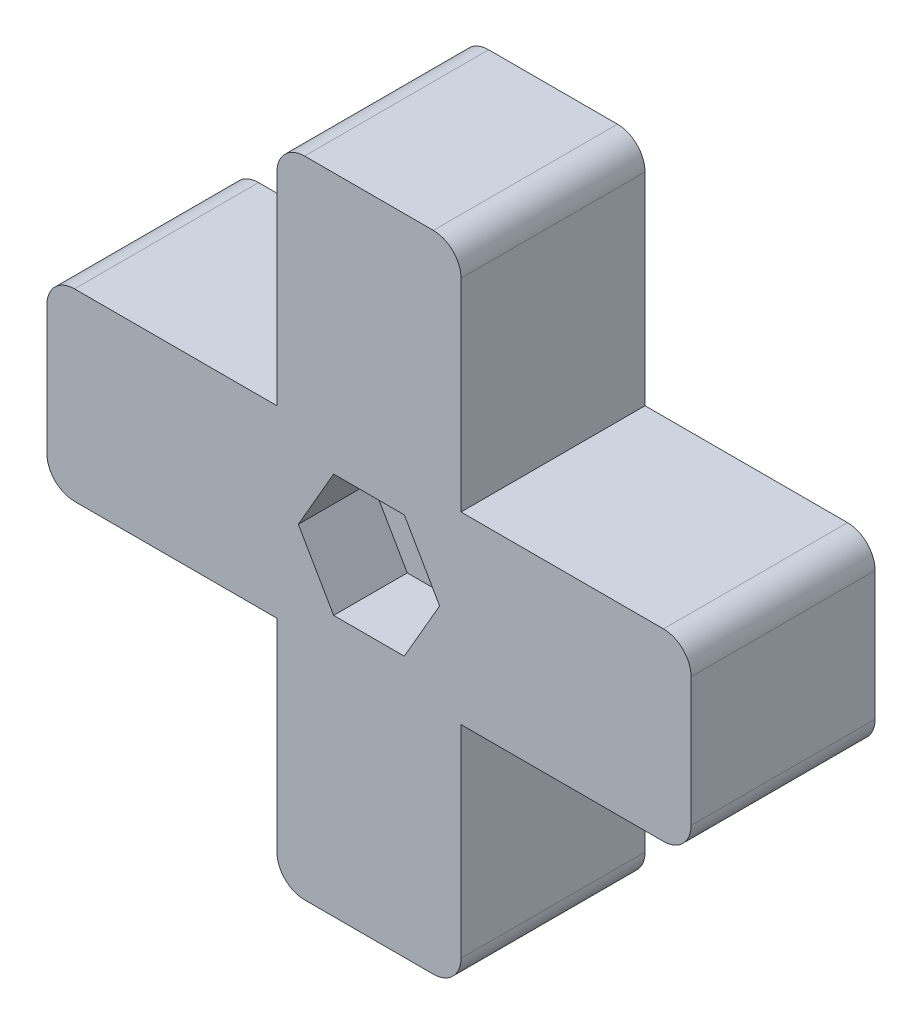
ISO-10303-21;
HEADER;
FILE_DESCRIPTION(('STEP AP214'),'2;1');
FILE_NAME('part.step','',(''),(''),'','','');
FILE_SCHEMA(('AUTOMOTIVE_DESIGN { 1 0 10303 214 1 1 1 1 }'));
ENDSEC;
DATA;
#1=APPLICATION_CONTEXT('core data for automotive mechanical design processes');
#2=APPLICATION_PROTOCOL_DEFINITION('international standard','automotive_design',2000,#1);
#3=PRODUCT_CONTEXT('',#1,'mechanical');
#4=PRODUCT('Part','Part','',(#3));
#5=PRODUCT_RELATED_PRODUCT_CATEGORY('part','',(#4));
#6=PRODUCT_DEFINITION_FORMATION('','',#4);
#7=PRODUCT_DEFINITION_CONTEXT('part definition',#1,'design');
#8=PRODUCT_DEFINITION('design','',#6,#7);
#9=PRODUCT_DEFINITION_SHAPE('','',#8);
#10=(LENGTH_UNIT() NAMED_UNIT(*) SI_UNIT(.MILLI.,.METRE.));
#11=(NAMED_UNIT(*) PLANE_ANGLE_UNIT() SI_UNIT($,.RADIAN.));
#12=(NAMED_UNIT(*) SI_UNIT($,.STERADIAN.) SOLID_ANGLE_UNIT());
#13=UNCERTAINTY_MEASURE_WITH_UNIT(LENGTH_MEASURE(1.E-05),#10,'distance_accuracy_value','');
#14=(GEOMETRIC_REPRESENTATION_CONTEXT(3) GLOBAL_UNCERTAINTY_ASSIGNED_CONTEXT((#13)) GLOBAL_UNIT_ASSIGNED_CONTEXT((#10,
#11,#12)) REPRESENTATION_CONTEXT('',''));
#15=CARTESIAN_POINT('',(0.,0.,0.));
#16=DIRECTION('',(0.,0.,1.));
#17=DIRECTION('',(1.,0.,0.));
#18=AXIS2_PLACEMENT_3D('',#15,#16,#17);
#19=CARTESIAN_POINT('',(35.,10.,-0.001000000000001));
#20=DIRECTION('',(0.,0.,1.));
#21=DIRECTION('',(1.,0.,0.));
#22=AXIS2_PLACEMENT_3D('',#19,#20,#21);
#23=CYLINDRICAL_SURFACE('',#22,4.05);
#24=CARTESIAN_POINT('',(35.,10.,0.));
#25=DIRECTION('',(0.,0.,1.));
#26=DIRECTION('',(1.,0.,0.));
#27=AXIS2_PLACEMENT_3D('',#24,#25,#26);
#28=CIRCLE('',#27,4.05);
#29=CARTESIAN_POINT('',(39.05,10.,0.));
#30=VERTEX_POINT('',#29);
#31=EDGE_CURVE('E270',#30,#30,#28,.F.);
#32=ORIENTED_EDGE('',*,*,#31,.T.);
#33=EDGE_LOOP('',(#32));
#34=FACE_BOUND('',#33,.T.);
#35=CARTESIAN_POINT('',(35.,10.,12.));
#36=DIRECTION('',(0.,0.,1.));
#37=DIRECTION('',(1.,0.,0.));
#38=AXIS2_PLACEMENT_3D('',#35,#36,#37);
#39=CIRCLE('',#38,4.05);
#40=CARTESIAN_POINT('',(39.05,10.,12.));
#41=VERTEX_POINT('',#40);
#42=EDGE_CURVE('E262',#41,#41,#39,.F.);
#43=ORIENTED_EDGE('',*,*,#42,.F.);
#44=EDGE_LOOP('',(#43));
#45=FACE_BOUND('',#44,.T.);
#46=ADVANCED_FACE('F35',(#34,#45),#23,.F.);
#47=CARTESIAN_POINT('',(0.,45.,20.));
#48=DIRECTION('',(0.,-1.,0.));
#49=DIRECTION('',(0.,0.,-1.));
#50=AXIS2_PLACEMENT_3D('',#47,#48,#49);
#51=PLANE('',#50);
#52=DIRECTION('',(-1.,0.,0.));
#53=VECTOR('',#52,1.);
#54=CARTESIAN_POINT('',(0.,45.,20.));
#55=LINE('',#54,#53);
#56=CARTESIAN_POINT('',(42.,45.,20.));
#57=VERTEX_POINT('',#56);
#58=CARTESIAN_POINT('',(28.,45.,20.));
#59=VERTEX_POINT('',#58);
#60=EDGE_CURVE('E274',#57,#59,#55,.T.);
#61=ORIENTED_EDGE('',*,*,#60,.F.);
#62=DIRECTION('',(0.,0.,-1.));
#63=VECTOR('',#62,1.);
#64=CARTESIAN_POINT('',(42.,45.,0.));
#65=LINE('',#64,#63);
#66=CARTESIAN_POINT('',(42.,45.,0.));
#67=VERTEX_POINT('',#66);
#68=EDGE_CURVE('E351',#57,#67,#65,.T.);
#69=ORIENTED_EDGE('',*,*,#68,.T.);
#70=DIRECTION('',(-1.,0.,0.));
#71=VECTOR('',#70,1.);
#72=CARTESIAN_POINT('',(0.,45.,0.));
#73=LINE('',#72,#71);
#74=CARTESIAN_POINT('',(28.,45.,0.));
#75=VERTEX_POINT('',#74);
#76=EDGE_CURVE('E273',#67,#75,#73,.T.);
#77=ORIENTED_EDGE('',*,*,#76,.T.);
#78=DIRECTION('',(0.,0.,-1.));
#79=VECTOR('',#78,1.);
#80=CARTESIAN_POINT('',(28.,45.,20.));
#81=LINE('',#80,#79);
#82=EDGE_CURVE('E347',#75,#59,#81,.F.);
#83=ORIENTED_EDGE('',*,*,#82,.T.);
#84=EDGE_LOOP('',(#61,#69,#77,#83));
#85=FACE_BOUND('',#84,.T.);
#86=ADVANCED_FACE('F484',(#85),#51,.F.);
#87=CARTESIAN_POINT('',(25.,0.,20.));
#88=DIRECTION('',(1.,0.,0.));
#89=DIRECTION('',(0.,0.,-1.));
#90=AXIS2_PLACEMENT_3D('',#87,#88,#89);
#91=PLANE('',#90);
#92=DIRECTION('',(0.,-1.,0.));
#93=VECTOR('',#92,1.);
#94=CARTESIAN_POINT('',(25.,0.,20.));
#95=LINE('',#94,#93);
#96=CARTESIAN_POINT('',(25.,42.,20.));
#97=VERTEX_POINT('',#96);
#98=CARTESIAN_POINT('',(25.,20.,20.));
#99=VERTEX_POINT('',#98);
#100=EDGE_CURVE('E277',#97,#99,#95,.T.);
#101=ORIENTED_EDGE('',*,*,#100,.F.);
#102=DIRECTION('',(0.,0.,-1.));
#103=VECTOR('',#102,1.);
#104=CARTESIAN_POINT('',(25.,42.,20.));
#105=LINE('',#104,#103);
#106=CARTESIAN_POINT('',(25.,42.,0.));
#107=VERTEX_POINT('',#106);
#108=EDGE_CURVE('E397',#97,#107,#105,.T.);
#109=ORIENTED_EDGE('',*,*,#108,.T.);
#110=DIRECTION('',(0.,-1.,0.));
#111=VECTOR('',#110,1.);
#112=CARTESIAN_POINT('',(25.,0.,0.));
#113=LINE('',#112,#111);
#114=CARTESIAN_POINT('',(25.,20.,0.));
#115=VERTEX_POINT('',#114);
#116=EDGE_CURVE('E309',#107,#115,#113,.T.);
#117=ORIENTED_EDGE('',*,*,#116,.T.);
#118=DIRECTION('',(0.,0.,-1.));
#119=VECTOR('',#118,1.);
#120=CARTESIAN_POINT('',(25.,20.,20.));
#121=LINE('',#120,#119);
#122=EDGE_CURVE('E344',#99,#115,#121,.T.);
#123=ORIENTED_EDGE('',*,*,#122,.F.);
#124=EDGE_LOOP('',(#101,#109,#117,#123));
#125=FACE_BOUND('',#124,.T.);
#126=ADVANCED_FACE('F494',(#125),#91,.F.);
#127=CARTESIAN_POINT('',(0.,20.,20.));
#128=DIRECTION('',(0.,1.,0.));
#129=DIRECTION('',(0.,0.,1.));
#130=AXIS2_PLACEMENT_3D('',#127,#128,#129);
#131=PLANE('',#130);
#132=DIRECTION('',(1.,0.,0.));
#133=VECTOR('',#132,1.);
#134=CARTESIAN_POINT('',(0.,20.,0.));
#135=LINE('',#134,#133);
#136=CARTESIAN_POINT('',(3.,20.,0.));
#137=VERTEX_POINT('',#136);
#138=EDGE_CURVE('E311',#137,#115,#135,.T.);
#139=ORIENTED_EDGE('',*,*,#138,.F.);
#140=DIRECTION('',(0.,0.,-1.));
#141=VECTOR('',#140,1.);
#142=CARTESIAN_POINT('',(3.,20.,20.));
#143=LINE('',#142,#141);
#144=CARTESIAN_POINT('',(3.,20.,20.));
#145=VERTEX_POINT('',#144);
#146=EDGE_CURVE('E11',#137,#145,#143,.F.);
#147=ORIENTED_EDGE('',*,*,#146,.T.);
#148=DIRECTION('',(1.,0.,0.));
#149=VECTOR('',#148,1.);
#150=CARTESIAN_POINT('',(0.,20.,20.));
#151=LINE('',#150,#149);
#152=EDGE_CURVE('E281',#145,#99,#151,.T.);
#153=ORIENTED_EDGE('',*,*,#152,.T.);
#154=ORIENTED_EDGE('',*,*,#122,.T.);
#155=EDGE_LOOP('',(#139,#147,#153,#154));
#156=FACE_BOUND('',#155,.T.);
#157=ADVANCED_FACE('F500',(#156),#131,.T.);
#158=CARTESIAN_POINT('',(0.,0.,20.));
#159=DIRECTION('',(-1.,0.,0.));
#160=DIRECTION('',(0.,0.,1.));
#161=AXIS2_PLACEMENT_3D('',#158,#159,#160);
#162=PLANE('',#161);
#163=DIRECTION('',(0.,1.,0.));
#164=VECTOR('',#163,1.);
#165=CARTESIAN_POINT('',(0.,0.,0.));
#166=LINE('',#165,#164);
#167=CARTESIAN_POINT('',(0.,3.,0.));
#168=VERTEX_POINT('',#167);
#169=CARTESIAN_POINT('',(0.,17.,0.));
#170=VERTEX_POINT('',#169);
#171=EDGE_CURVE('E314',#168,#170,#166,.T.);
#172=ORIENTED_EDGE('',*,*,#171,.F.);
#173=DIRECTION('',(0.,0.,-1.));
#174=VECTOR('',#173,1.);
#175=CARTESIAN_POINT('',(0.,3.,20.));
#176=LINE('',#175,#174);
#177=CARTESIAN_POINT('',(0.,3.,20.));
#178=VERTEX_POINT('',#177);
#179=EDGE_CURVE('E43',#168,#178,#176,.F.);
#180=ORIENTED_EDGE('',*,*,#179,.T.);
#181=DIRECTION('',(0.,1.,0.));
#182=VECTOR('',#181,1.);
#183=CARTESIAN_POINT('',(0.,0.,20.));
#184=LINE('',#183,#182);
#185=CARTESIAN_POINT('',(0.,17.,20.));
#186=VERTEX_POINT('',#185);
#187=EDGE_CURVE('E283',#178,#186,#184,.T.);
#188=ORIENTED_EDGE('',*,*,#187,.T.);
#189=DIRECTION('',(0.,0.,-1.));
#190=VECTOR('',#189,1.);
#191=CARTESIAN_POINT('',(0.,17.,20.));
#192=LINE('',#191,#190);
#193=EDGE_CURVE('E412',#186,#170,#192,.T.);
#194=ORIENTED_EDGE('',*,*,#193,.T.);
#195=EDGE_LOOP('',(#172,#180,#188,#194));
#196=FACE_BOUND('',#195,.T.);
#197=ADVANCED_FACE('F418',(#196),#162,.T.);
#198=CARTESIAN_POINT('',(0.,0.,20.));
#199=DIRECTION('',(0.,1.,0.));
#200=DIRECTION('',(0.,0.,1.));
#201=AXIS2_PLACEMENT_3D('',#198,#199,#200);
#202=PLANE('',#201);
#203=DIRECTION('',(1.,0.,0.));
#204=VECTOR('',#203,1.);
#205=CARTESIAN_POINT('',(0.,0.,20.));
#206=LINE('',#205,#204);
#207=CARTESIAN_POINT('',(3.,0.,20.));
#208=VERTEX_POINT('',#207);
#209=CARTESIAN_POINT('',(25.,0.,20.));
#210=VERTEX_POINT('',#209);
#211=EDGE_CURVE('E286',#208,#210,#206,.T.);
#212=ORIENTED_EDGE('',*,*,#211,.F.);
#213=DIRECTION('',(0.,0.,-1.));
#214=VECTOR('',#213,1.);
#215=CARTESIAN_POINT('',(3.,0.,0.));
#216=LINE('',#215,#214);
#217=CARTESIAN_POINT('',(3.,0.,0.));
#218=VERTEX_POINT('',#217);
#219=EDGE_CURVE('E409',#208,#218,#216,.T.);
#220=ORIENTED_EDGE('',*,*,#219,.T.);
#221=DIRECTION('',(1.,0.,0.));
#222=VECTOR('',#221,1.);
#223=CARTESIAN_POINT('',(0.,0.,0.));
#224=LINE('',#223,#222);
#225=CARTESIAN_POINT('',(25.,0.,0.));
#226=VERTEX_POINT('',#225);
#227=EDGE_CURVE('E317',#218,#226,#224,.T.);
#228=ORIENTED_EDGE('',*,*,#227,.T.);
#229=DIRECTION('',(0.,0.,-1.));
#230=VECTOR('',#229,1.);
#231=CARTESIAN_POINT('',(25.,0.,20.));
#232=LINE('',#231,#230);
#233=EDGE_CURVE('E341',#210,#226,#232,.T.);
#234=ORIENTED_EDGE('',*,*,#233,.F.);
#235=EDGE_LOOP('',(#212,#220,#228,#234));
#236=FACE_BOUND('',#235,.T.);
#237=ADVANCED_FACE('F431',(#236),#202,.F.);
#238=CARTESIAN_POINT('',(25.,0.,20.));
#239=DIRECTION('',(1.,0.,0.));
#240=DIRECTION('',(0.,0.,-1.));
#241=AXIS2_PLACEMENT_3D('',#238,#239,#240);
#242=PLANE('',#241);
#243=DIRECTION('',(0.,-1.,0.));
#244=VECTOR('',#243,1.);
#245=CARTESIAN_POINT('',(25.,0.,0.));
#246=LINE('',#245,#244);
#247=CARTESIAN_POINT('',(25.,-22.,0.));
#248=VERTEX_POINT('',#247);
#249=EDGE_CURVE('E319',#226,#248,#246,.T.);
#250=ORIENTED_EDGE('',*,*,#249,.T.);
#251=DIRECTION('',(0.,0.,-1.));
#252=VECTOR('',#251,1.);
#253=CARTESIAN_POINT('',(25.,-22.,20.));
#254=LINE('',#253,#252);
#255=CARTESIAN_POINT('',(25.,-22.,20.));
#256=VERTEX_POINT('',#255);
#257=EDGE_CURVE('E395',#248,#256,#254,.F.);
#258=ORIENTED_EDGE('',*,*,#257,.T.);
#259=DIRECTION('',(0.,-1.,0.));
#260=VECTOR('',#259,1.);
#261=CARTESIAN_POINT('',(25.,0.,20.));
#262=LINE('',#261,#260);
#263=EDGE_CURVE('E288',#210,#256,#262,.T.);
#264=ORIENTED_EDGE('',*,*,#263,.F.);
#265=ORIENTED_EDGE('',*,*,#233,.T.);
#266=EDGE_LOOP('',(#250,#258,#264,#265));
#267=FACE_BOUND('',#266,.T.);
#268=ADVANCED_FACE('F439',(#267),#242,.F.);
#269=CARTESIAN_POINT('',(0.,-25.,20.));
#270=DIRECTION('',(0.,-1.,0.));
#271=DIRECTION('',(1.,0.,0.));
#272=AXIS2_PLACEMENT_3D('',#269,#270,#271);
#273=PLANE('',#272);
#274=DIRECTION('',(-1.,0.,0.));
#275=VECTOR('',#274,1.);
#276=CARTESIAN_POINT('',(0.,-25.,0.));
#277=LINE('',#276,#275);
#278=CARTESIAN_POINT('',(42.,-25.,0.));
#279=VERTEX_POINT('',#278);
#280=CARTESIAN_POINT('',(28.,-25.,0.));
#281=VERTEX_POINT('',#280);
#282=EDGE_CURVE('E322',#279,#281,#277,.T.);
#283=ORIENTED_EDGE('',*,*,#282,.F.);
#284=DIRECTION('',(0.,0.,-1.));
#285=VECTOR('',#284,1.);
#286=CARTESIAN_POINT('',(42.,-25.,20.));
#287=LINE('',#286,#285);
#288=CARTESIAN_POINT('',(42.,-25.,20.));
#289=VERTEX_POINT('',#288);
#290=EDGE_CURVE('E393',#279,#289,#287,.F.);
#291=ORIENTED_EDGE('',*,*,#290,.T.);
#292=DIRECTION('',(-1.,0.,0.));
#293=VECTOR('',#292,1.);
#294=CARTESIAN_POINT('',(0.,-25.,20.));
#295=LINE('',#294,#293);
#296=CARTESIAN_POINT('',(28.,-25.,20.));
#297=VERTEX_POINT('',#296);
#298=EDGE_CURVE('E291',#289,#297,#295,.T.);
#299=ORIENTED_EDGE('',*,*,#298,.T.);
#300=DIRECTION('',(0.,0.,-1.));
#301=VECTOR('',#300,1.);
#302=CARTESIAN_POINT('',(28.,-25.,0.));
#303=LINE('',#302,#301);
#304=EDGE_CURVE('E390',#297,#281,#303,.T.);
#305=ORIENTED_EDGE('',*,*,#304,.T.);
#306=EDGE_LOOP('',(#283,#291,#299,#305));
#307=FACE_BOUND('',#306,.T.);
#308=ADVANCED_FACE('F449',(#307),#273,.T.);
#309=CARTESIAN_POINT('',(45.,0.,20.));
#310=DIRECTION('',(1.,0.,0.));
#311=DIRECTION('',(0.,1.,0.));
#312=AXIS2_PLACEMENT_3D('',#309,#310,#311);
#313=PLANE('',#312);
#314=DIRECTION('',(0.,-1.,0.));
#315=VECTOR('',#314,1.);
#316=CARTESIAN_POINT('',(45.,0.,20.));
#317=LINE('',#316,#315);
#318=CARTESIAN_POINT('',(45.,0.,20.));
#319=VERTEX_POINT('',#318);
#320=CARTESIAN_POINT('',(45.,-22.,20.));
#321=VERTEX_POINT('',#320);
#322=EDGE_CURVE('E294',#319,#321,#317,.T.);
#323=ORIENTED_EDGE('',*,*,#322,.T.);
#324=DIRECTION('',(0.,0.,-1.));
#325=VECTOR('',#324,1.);
#326=CARTESIAN_POINT('',(45.,-22.,20.));
#327=LINE('',#326,#325);
#328=CARTESIAN_POINT('',(45.,-22.,0.));
#329=VERTEX_POINT('',#328);
#330=EDGE_CURVE('E387',#321,#329,#327,.T.);
#331=ORIENTED_EDGE('',*,*,#330,.T.);
#332=DIRECTION('',(0.,-1.,0.));
#333=VECTOR('',#332,1.);
#334=CARTESIAN_POINT('',(45.,0.,0.));
#335=LINE('',#334,#333);
#336=CARTESIAN_POINT('',(45.,0.,0.));
#337=VERTEX_POINT('',#336);
#338=EDGE_CURVE('E325',#337,#329,#335,.T.);
#339=ORIENTED_EDGE('',*,*,#338,.F.);
#340=DIRECTION('',(0.,0.,-1.));
#341=VECTOR('',#340,1.);
#342=CARTESIAN_POINT('',(45.,0.,20.));
#343=LINE('',#342,#341);
#344=EDGE_CURVE('E339',#319,#337,#343,.T.);
#345=ORIENTED_EDGE('',*,*,#344,.F.);
#346=EDGE_LOOP('',(#323,#331,#339,#345));
#347=FACE_BOUND('',#346,.T.);
#348=ADVANCED_FACE('F456',(#347),#313,.T.);
#349=CARTESIAN_POINT('',(0.,0.,20.));
#350=DIRECTION('',(0.,1.,0.));
#351=DIRECTION('',(0.,0.,1.));
#352=AXIS2_PLACEMENT_3D('',#349,#350,#351);
#353=PLANE('',#352);
#354=DIRECTION('',(1.,0.,0.));
#355=VECTOR('',#354,1.);
#356=CARTESIAN_POINT('',(0.,0.,0.));
#357=LINE('',#356,#355);
#358=CARTESIAN_POINT('',(67.,0.,0.));
#359=VERTEX_POINT('',#358);
#360=EDGE_CURVE('E328',#337,#359,#357,.T.);
#361=ORIENTED_EDGE('',*,*,#360,.T.);
#362=DIRECTION('',(0.,0.,-1.));
#363=VECTOR('',#362,1.);
#364=CARTESIAN_POINT('',(67.,0.,20.));
#365=LINE('',#364,#363);
#366=CARTESIAN_POINT('',(67.,0.,20.));
#367=VERTEX_POINT('',#366);
#368=EDGE_CURVE('E407',#359,#367,#365,.F.);
#369=ORIENTED_EDGE('',*,*,#368,.T.);
#370=DIRECTION('',(1.,0.,0.));
#371=VECTOR('',#370,1.);
#372=CARTESIAN_POINT('',(0.,0.,20.));
#373=LINE('',#372,#371);
#374=EDGE_CURVE('E297',#319,#367,#373,.T.);
#375=ORIENTED_EDGE('',*,*,#374,.F.);
#376=ORIENTED_EDGE('',*,*,#344,.T.);
#377=EDGE_LOOP('',(#361,#369,#375,#376));
#378=FACE_BOUND('',#377,.T.);
#379=ADVANCED_FACE('F461',(#378),#353,.F.);
#380=CARTESIAN_POINT('',(70.,0.,20.));
#381=DIRECTION('',(-1.,0.,0.));
#382=DIRECTION('',(0.,0.,1.));
#383=AXIS2_PLACEMENT_3D('',#380,#381,#382);
#384=PLANE('',#383);
#385=DIRECTION('',(0.,1.,0.));
#386=VECTOR('',#385,1.);
#387=CARTESIAN_POINT('',(70.,0.,0.));
#388=LINE('',#387,#386);
#389=CARTESIAN_POINT('',(70.,3.,0.));
#390=VERTEX_POINT('',#389);
#391=CARTESIAN_POINT('',(70.,17.,0.));
#392=VERTEX_POINT('',#391);
#393=EDGE_CURVE('E331',#390,#392,#388,.T.);
#394=ORIENTED_EDGE('',*,*,#393,.T.);
#395=DIRECTION('',(0.,0.,-1.));
#396=VECTOR('',#395,1.);
#397=CARTESIAN_POINT('',(70.,17.,20.));
#398=LINE('',#397,#396);
#399=CARTESIAN_POINT('',(70.,17.,20.));
#400=VERTEX_POINT('',#399);
#401=EDGE_CURVE('E58',#392,#400,#398,.F.);
#402=ORIENTED_EDGE('',*,*,#401,.T.);
#403=DIRECTION('',(0.,1.,0.));
#404=VECTOR('',#403,1.);
#405=CARTESIAN_POINT('',(70.,0.,20.));
#406=LINE('',#405,#404);
#407=CARTESIAN_POINT('',(70.,3.,20.));
#408=VERTEX_POINT('',#407);
#409=EDGE_CURVE('E300',#408,#400,#406,.T.);
#410=ORIENTED_EDGE('',*,*,#409,.F.);
#411=DIRECTION('',(0.,0.,-1.));
#412=VECTOR('',#411,1.);
#413=CARTESIAN_POINT('',(70.,3.,20.));
#414=LINE('',#413,#412);
#415=EDGE_CURVE('E403',#408,#390,#414,.T.);
#416=ORIENTED_EDGE('',*,*,#415,.T.);
#417=EDGE_LOOP('',(#394,#402,#410,#416));
#418=FACE_BOUND('',#417,.T.);
#419=ADVANCED_FACE('F468',(#418),#384,.F.);
#420=CARTESIAN_POINT('',(0.,20.,20.));
#421=DIRECTION('',(0.,1.,0.));
#422=DIRECTION('',(0.,0.,1.));
#423=AXIS2_PLACEMENT_3D('',#420,#421,#422);
#424=PLANE('',#423);
#425=DIRECTION('',(1.,0.,0.));
#426=VECTOR('',#425,1.);
#427=CARTESIAN_POINT('',(0.,20.,20.));
#428=LINE('',#427,#426);
#429=CARTESIAN_POINT('',(45.,20.,20.));
#430=VERTEX_POINT('',#429);
#431=CARTESIAN_POINT('',(67.,20.,20.));
#432=VERTEX_POINT('',#431);
#433=EDGE_CURVE('E302',#430,#432,#428,.T.);
#434=ORIENTED_EDGE('',*,*,#433,.T.);
#435=DIRECTION('',(0.,0.,-1.));
#436=VECTOR('',#435,1.);
#437=CARTESIAN_POINT('',(67.,20.,0.));
#438=LINE('',#437,#436);
#439=CARTESIAN_POINT('',(67.,20.,0.));
#440=VERTEX_POINT('',#439);
#441=EDGE_CURVE('E400',#432,#440,#438,.T.);
#442=ORIENTED_EDGE('',*,*,#441,.T.);
#443=DIRECTION('',(1.,0.,0.));
#444=VECTOR('',#443,1.);
#445=CARTESIAN_POINT('',(0.,20.,0.));
#446=LINE('',#445,#444);
#447=CARTESIAN_POINT('',(45.,20.,0.));
#448=VERTEX_POINT('',#447);
#449=EDGE_CURVE('E333',#448,#440,#446,.T.);
#450=ORIENTED_EDGE('',*,*,#449,.F.);
#451=DIRECTION('',(0.,0.,-1.));
#452=VECTOR('',#451,1.);
#453=CARTESIAN_POINT('',(45.,20.,20.));
#454=LINE('',#453,#452);
#455=EDGE_CURVE('E306',#430,#448,#454,.T.);
#456=ORIENTED_EDGE('',*,*,#455,.F.);
#457=EDGE_LOOP('',(#434,#442,#450,#456));
#458=FACE_BOUND('',#457,.T.);
#459=ADVANCED_FACE('F474',(#458),#424,.T.);
#460=CARTESIAN_POINT('',(45.,0.,20.));
#461=DIRECTION('',(1.,0.,0.));
#462=DIRECTION('',(0.,1.,0.));
#463=AXIS2_PLACEMENT_3D('',#460,#461,#462);
#464=PLANE('',#463);
#465=DIRECTION('',(0.,-1.,0.));
#466=VECTOR('',#465,1.);
#467=CARTESIAN_POINT('',(45.,0.,0.));
#468=LINE('',#467,#466);
#469=CARTESIAN_POINT('',(45.,42.,0.));
#470=VERTEX_POINT('',#469);
#471=EDGE_CURVE('E278',#470,#448,#468,.T.);
#472=ORIENTED_EDGE('',*,*,#471,.F.);
#473=DIRECTION('',(0.,0.,-1.));
#474=VECTOR('',#473,1.);
#475=CARTESIAN_POINT('',(45.,42.,20.));
#476=LINE('',#475,#474);
#477=CARTESIAN_POINT('',(45.,42.,20.));
#478=VERTEX_POINT('',#477);
#479=EDGE_CURVE('E370',#470,#478,#476,.F.);
#480=ORIENTED_EDGE('',*,*,#479,.T.);
#481=DIRECTION('',(0.,-1.,0.));
#482=VECTOR('',#481,1.);
#483=CARTESIAN_POINT('',(45.,0.,20.));
#484=LINE('',#483,#482);
#485=EDGE_CURVE('E304',#478,#430,#484,.T.);
#486=ORIENTED_EDGE('',*,*,#485,.T.);
#487=ORIENTED_EDGE('',*,*,#455,.T.);
#488=EDGE_LOOP('',(#472,#480,#486,#487));
#489=FACE_BOUND('',#488,.T.);
#490=ADVANCED_FACE('F522',(#489),#464,.T.);
#491=CARTESIAN_POINT('',(0.,0.,20.));
#492=DIRECTION('',(0.,0.,1.));
#493=DIRECTION('',(1.,0.,0.));
#494=AXIS2_PLACEMENT_3D('',#491,#492,#493);
#495=PLANE('',#494);
#496=DIRECTION('',(-0.5,-0.866025403784439,0.));
#497=VECTOR('',#496,1.);
#498=CARTESIAN_POINT('',(31.160620709889,16.65,20.));
#499=LINE('',#498,#497);
#500=CARTESIAN_POINT('',(31.160620709889,16.65,20.));
#501=VERTEX_POINT('',#500);
#502=CARTESIAN_POINT('',(27.321241419778,9.99999999999999,20.));
#503=VERTEX_POINT('',#502);
#504=EDGE_CURVE('E217',#501,#503,#499,.T.);
#505=ORIENTED_EDGE('',*,*,#504,.F.);
#506=DIRECTION('',(-1.,0.,0.));
#507=VECTOR('',#506,1.);
#508=CARTESIAN_POINT('',(38.839379290111,16.65,20.));
#509=LINE('',#508,#507);
#510=CARTESIAN_POINT('',(38.839379290111,16.65,20.));
#511=VERTEX_POINT('',#510);
#512=EDGE_CURVE('E236',#511,#501,#509,.T.);
#513=ORIENTED_EDGE('',*,*,#512,.F.);
#514=DIRECTION('',(-0.500000000000001,0.866025403784438,0.));
#515=VECTOR('',#514,1.);
#516=CARTESIAN_POINT('',(42.678758580222,10.,20.));
#517=LINE('',#516,#515);
#518=CARTESIAN_POINT('',(42.678758580222,10.,20.));
#519=VERTEX_POINT('',#518);
#520=EDGE_CURVE('E239',#519,#511,#517,.T.);
#521=ORIENTED_EDGE('',*,*,#520,.F.);
#522=DIRECTION('',(0.499999999999999,0.866025403784439,0.));
#523=VECTOR('',#522,1.);
#524=CARTESIAN_POINT('',(38.839379290111,3.35,20.));
#525=LINE('',#524,#523);
#526=CARTESIAN_POINT('',(38.839379290111,3.35,20.));
#527=VERTEX_POINT('',#526);
#528=EDGE_CURVE('E255',#527,#519,#525,.T.);
#529=ORIENTED_EDGE('',*,*,#528,.F.);
#530=DIRECTION('',(1.,0.,0.));
#531=VECTOR('',#530,1.);
#532=CARTESIAN_POINT('',(31.160620709889,3.35,20.));
#533=LINE('',#532,#531);
#534=CARTESIAN_POINT('',(31.160620709889,3.35,20.));
#535=VERTEX_POINT('',#534);
#536=EDGE_CURVE('E252',#535,#527,#533,.T.);
#537=ORIENTED_EDGE('',*,*,#536,.F.);
#538=DIRECTION('',(0.5,-0.866025403784438,0.));
#539=VECTOR('',#538,1.);
#540=CARTESIAN_POINT('',(27.321241419778,9.99999999999999,20.));
#541=LINE('',#540,#539);
#542=EDGE_CURVE('E250',#503,#535,#541,.T.);
#543=ORIENTED_EDGE('',*,*,#542,.F.);
#544=EDGE_LOOP('',(#505,#513,#521,#529,#537,#543));
#545=FACE_BOUND('',#544,.T.);
#546=ORIENTED_EDGE('',*,*,#485,.F.);
#547=CARTESIAN_POINT('',(42.,42.,20.));
#548=DIRECTION('',(0.,0.,1.));
#549=DIRECTION('',(1.,0.,0.));
#550=AXIS2_PLACEMENT_3D('',#547,#548,#549);
#551=CIRCLE('',#550,3.);
#552=EDGE_CURVE('E385',#478,#57,#551,.T.);
#553=ORIENTED_EDGE('',*,*,#552,.T.);
#554=ORIENTED_EDGE('',*,*,#60,.T.);
#555=CARTESIAN_POINT('',(28.,42.,20.));
#556=DIRECTION('',(0.,0.,1.));
#557=DIRECTION('',(1.,0.,0.));
#558=AXIS2_PLACEMENT_3D('',#555,#556,#557);
#559=CIRCLE('',#558,3.);
#560=EDGE_CURVE('E379',#59,#97,#559,.T.);
#561=ORIENTED_EDGE('',*,*,#560,.T.);
#562=ORIENTED_EDGE('',*,*,#100,.T.);
#563=ORIENTED_EDGE('',*,*,#152,.F.);
#564=CARTESIAN_POINT('',(3.,17.,20.));
#565=DIRECTION('',(0.,0.,1.));
#566=DIRECTION('',(1.,0.,0.));
#567=AXIS2_PLACEMENT_3D('',#564,#565,#566);
#568=CIRCLE('',#567,3.);
#569=EDGE_CURVE('E372',#145,#186,#568,.T.);
#570=ORIENTED_EDGE('',*,*,#569,.T.);
#571=ORIENTED_EDGE('',*,*,#187,.F.);
#572=CARTESIAN_POINT('',(3.,3.,20.));
#573=DIRECTION('',(0.,0.,1.));
#574=DIRECTION('',(1.,0.,0.));
#575=AXIS2_PLACEMENT_3D('',#572,#573,#574);
#576=CIRCLE('',#575,3.);
#577=EDGE_CURVE('E374',#178,#208,#576,.T.);
#578=ORIENTED_EDGE('',*,*,#577,.T.);
#579=ORIENTED_EDGE('',*,*,#211,.T.);
#580=ORIENTED_EDGE('',*,*,#263,.T.);
#581=CARTESIAN_POINT('',(28.,-22.,20.));
#582=DIRECTION('',(0.,0.,1.));
#583=DIRECTION('',(1.,0.,0.));
#584=AXIS2_PLACEMENT_3D('',#581,#582,#583);
#585=CIRCLE('',#584,3.);
#586=EDGE_CURVE('E381',#256,#297,#585,.T.);
#587=ORIENTED_EDGE('',*,*,#586,.T.);
#588=ORIENTED_EDGE('',*,*,#298,.F.);
#589=CARTESIAN_POINT('',(42.,-22.,20.));
#590=DIRECTION('',(0.,0.,1.));
#591=DIRECTION('',(1.,0.,0.));
#592=AXIS2_PLACEMENT_3D('',#589,#590,#591);
#593=CIRCLE('',#592,3.);
#594=EDGE_CURVE('E383',#289,#321,#593,.T.);
#595=ORIENTED_EDGE('',*,*,#594,.T.);
#596=ORIENTED_EDGE('',*,*,#322,.F.);
#597=ORIENTED_EDGE('',*,*,#374,.T.);
#598=CARTESIAN_POINT('',(67.,3.,20.));
#599=DIRECTION('',(0.,0.,1.));
#600=DIRECTION('',(1.,0.,0.));
#601=AXIS2_PLACEMENT_3D('',#598,#599,#600);
#602=CIRCLE('',#601,3.);
#603=EDGE_CURVE('E376',#367,#408,#602,.T.);
#604=ORIENTED_EDGE('',*,*,#603,.T.);
#605=ORIENTED_EDGE('',*,*,#409,.T.);
#606=CARTESIAN_POINT('',(67.,17.,20.));
#607=DIRECTION('',(0.,0.,1.));
#608=DIRECTION('',(1.,0.,0.));
#609=AXIS2_PLACEMENT_3D('',#606,#607,#608);
#610=CIRCLE('',#609,3.);
#611=EDGE_CURVE('E50',#400,#432,#610,.T.);
#612=ORIENTED_EDGE('',*,*,#611,.T.);
#613=ORIENTED_EDGE('',*,*,#433,.F.);
#614=EDGE_LOOP('',(#546,#553,#554,#561,#562,#563,#570,#571,#578,#579,#580,#587,#588,#595,#596,
#597,#604,#605,#612,#613));
#615=FACE_BOUND('',#614,.T.);
#616=ADVANCED_FACE('F423',(#545,#615),#495,.T.);
#617=CARTESIAN_POINT('',(0.,0.,0.));
#618=DIRECTION('',(0.,0.,1.));
#619=DIRECTION('',(1.,0.,0.));
#620=AXIS2_PLACEMENT_3D('',#617,#618,#619);
#621=PLANE('',#620);
#622=ORIENTED_EDGE('',*,*,#31,.F.);
#623=EDGE_LOOP('',(#622));
#624=FACE_BOUND('',#623,.T.);
#625=ORIENTED_EDGE('',*,*,#76,.F.);
#626=CARTESIAN_POINT('',(42.,42.,0.));
#627=DIRECTION('',(0.,0.,1.));
#628=DIRECTION('',(1.,0.,0.));
#629=AXIS2_PLACEMENT_3D('',#626,#627,#628);
#630=CIRCLE('',#629,3.);
#631=EDGE_CURVE('E368',#67,#470,#630,.F.);
#632=ORIENTED_EDGE('',*,*,#631,.T.);
#633=ORIENTED_EDGE('',*,*,#471,.T.);
#634=ORIENTED_EDGE('',*,*,#449,.T.);
#635=CARTESIAN_POINT('',(67.,17.,0.));
#636=DIRECTION('',(0.,0.,1.));
#637=DIRECTION('',(1.,0.,0.));
#638=AXIS2_PLACEMENT_3D('',#635,#636,#637);
#639=CIRCLE('',#638,3.);
#640=EDGE_CURVE('E360',#440,#392,#639,.F.);
#641=ORIENTED_EDGE('',*,*,#640,.T.);
#642=ORIENTED_EDGE('',*,*,#393,.F.);
#643=CARTESIAN_POINT('',(67.,3.,0.));
#644=DIRECTION('',(0.,0.,1.));
#645=DIRECTION('',(1.,0.,0.));
#646=AXIS2_PLACEMENT_3D('',#643,#644,#645);
#647=CIRCLE('',#646,3.);
#648=EDGE_CURVE('E358',#390,#359,#647,.F.);
#649=ORIENTED_EDGE('',*,*,#648,.T.);
#650=ORIENTED_EDGE('',*,*,#360,.F.);
#651=ORIENTED_EDGE('',*,*,#338,.T.);
#652=CARTESIAN_POINT('',(42.,-22.,0.));
#653=DIRECTION('',(0.,0.,1.));
#654=DIRECTION('',(1.,0.,0.));
#655=AXIS2_PLACEMENT_3D('',#652,#653,#654);
#656=CIRCLE('',#655,3.);
#657=EDGE_CURVE('E366',#329,#279,#656,.F.);
#658=ORIENTED_EDGE('',*,*,#657,.T.);
#659=ORIENTED_EDGE('',*,*,#282,.T.);
#660=CARTESIAN_POINT('',(28.,-22.,0.));
#661=DIRECTION('',(0.,0.,1.));
#662=DIRECTION('',(1.,0.,0.));
#663=AXIS2_PLACEMENT_3D('',#660,#661,#662);
#664=CIRCLE('',#663,3.);
#665=EDGE_CURVE('E364',#281,#248,#664,.F.);
#666=ORIENTED_EDGE('',*,*,#665,.T.);
#667=ORIENTED_EDGE('',*,*,#249,.F.);
#668=ORIENTED_EDGE('',*,*,#227,.F.);
#669=CARTESIAN_POINT('',(3.,3.,0.));
#670=DIRECTION('',(0.,0.,1.));
#671=DIRECTION('',(1.,0.,0.));
#672=AXIS2_PLACEMENT_3D('',#669,#670,#671);
#673=CIRCLE('',#672,3.);
#674=EDGE_CURVE('E356',#218,#168,#673,.F.);
#675=ORIENTED_EDGE('',*,*,#674,.T.);
#676=ORIENTED_EDGE('',*,*,#171,.T.);
#677=CARTESIAN_POINT('',(3.,17.,0.));
#678=DIRECTION('',(0.,0.,1.));
#679=DIRECTION('',(1.,0.,0.));
#680=AXIS2_PLACEMENT_3D('',#677,#678,#679);
#681=CIRCLE('',#680,3.);
#682=EDGE_CURVE('E354',#170,#137,#681,.F.);
#683=ORIENTED_EDGE('',*,*,#682,.T.);
#684=ORIENTED_EDGE('',*,*,#138,.T.);
#685=ORIENTED_EDGE('',*,*,#116,.F.);
#686=CARTESIAN_POINT('',(28.,42.,0.));
#687=DIRECTION('',(0.,0.,1.));
#688=DIRECTION('',(1.,0.,0.));
#689=AXIS2_PLACEMENT_3D('',#686,#687,#688);
#690=CIRCLE('',#689,3.);
#691=EDGE_CURVE('E362',#107,#75,#690,.F.);
#692=ORIENTED_EDGE('',*,*,#691,.T.);
#693=EDGE_LOOP('',(#625,#632,#633,#634,#641,#642,#649,#650,#651,#658,#659,#666,#667,#668,#675,
#676,#683,#684,#685,#692));
#694=FACE_BOUND('',#693,.T.);
#695=ADVANCED_FACE('F436',(#624,#694),#621,.F.);
#696=CARTESIAN_POINT('',(0.,0.,12.));
#697=DIRECTION('',(0.,0.,1.));
#698=DIRECTION('',(1.,0.,0.));
#699=AXIS2_PLACEMENT_3D('',#696,#697,#698);
#700=PLANE('',#699);
#701=DIRECTION('',(-0.5,-0.866025403784439,0.));
#702=VECTOR('',#701,1.);
#703=CARTESIAN_POINT('',(31.160620709889,16.65,12.));
#704=LINE('',#703,#702);
#705=CARTESIAN_POINT('',(31.160620709889,16.65,12.));
#706=VERTEX_POINT('',#705);
#707=CARTESIAN_POINT('',(27.321241419778,9.99999999999999,12.));
#708=VERTEX_POINT('',#707);
#709=EDGE_CURVE('E214',#706,#708,#704,.T.);
#710=ORIENTED_EDGE('',*,*,#709,.T.);
#711=DIRECTION('',(0.5,-0.866025403784438,0.));
#712=VECTOR('',#711,1.);
#713=CARTESIAN_POINT('',(27.321241419778,9.99999999999999,12.));
#714=LINE('',#713,#712);
#715=CARTESIAN_POINT('',(31.160620709889,3.35,12.));
#716=VERTEX_POINT('',#715);
#717=EDGE_CURVE('E225',#708,#716,#714,.T.);
#718=ORIENTED_EDGE('',*,*,#717,.T.);
#719=DIRECTION('',(1.,0.,0.));
#720=VECTOR('',#719,1.);
#721=CARTESIAN_POINT('',(31.160620709889,3.35,12.));
#722=LINE('',#721,#720);
#723=CARTESIAN_POINT('',(38.839379290111,3.35,12.));
#724=VERTEX_POINT('',#723);
#725=EDGE_CURVE('E230',#716,#724,#722,.T.);
#726=ORIENTED_EDGE('',*,*,#725,.T.);
#727=DIRECTION('',(0.499999999999999,0.866025403784439,0.));
#728=VECTOR('',#727,1.);
#729=CARTESIAN_POINT('',(38.839379290111,3.35,12.));
#730=LINE('',#729,#728);
#731=CARTESIAN_POINT('',(42.678758580222,10.,12.));
#732=VERTEX_POINT('',#731);
#733=EDGE_CURVE('E243',#724,#732,#730,.T.);
#734=ORIENTED_EDGE('',*,*,#733,.T.);
#735=DIRECTION('',(-0.500000000000001,0.866025403784438,0.));
#736=VECTOR('',#735,1.);
#737=CARTESIAN_POINT('',(42.678758580222,10.,12.));
#738=LINE('',#737,#736);
#739=CARTESIAN_POINT('',(38.839379290111,16.65,12.));
#740=VERTEX_POINT('',#739);
#741=EDGE_CURVE('E246',#732,#740,#738,.T.);
#742=ORIENTED_EDGE('',*,*,#741,.T.);
#743=DIRECTION('',(-1.,0.,0.));
#744=VECTOR('',#743,1.);
#745=CARTESIAN_POINT('',(38.839379290111,16.65,12.));
#746=LINE('',#745,#744);
#747=EDGE_CURVE('E222',#740,#706,#746,.T.);
#748=ORIENTED_EDGE('',*,*,#747,.T.);
#749=EDGE_LOOP('',(#710,#718,#726,#734,#742,#748));
#750=FACE_BOUND('',#749,.T.);
#751=ORIENTED_EDGE('',*,*,#42,.T.);
#752=EDGE_LOOP('',(#751));
#753=FACE_BOUND('',#752,.T.);
#754=ADVANCED_FACE('F232',(#750,#753),#700,.T.);
#755=CARTESIAN_POINT('',(31.160620709889,16.65,12.));
#756=DIRECTION('',(-0.866025403784439,0.5,0.));
#757=DIRECTION('',(-0.5,-0.866025403784439,0.));
#758=AXIS2_PLACEMENT_3D('',#755,#756,#757);
#759=PLANE('',#758);
#760=ORIENTED_EDGE('',*,*,#504,.T.);
#761=DIRECTION('',(0.,0.,1.));
#762=VECTOR('',#761,1.);
#763=CARTESIAN_POINT('',(27.321241419778,9.99999999999999,12.));
#764=LINE('',#763,#762);
#765=EDGE_CURVE('E210',#708,#503,#764,.T.);
#766=ORIENTED_EDGE('',*,*,#765,.F.);
#767=ORIENTED_EDGE('',*,*,#709,.F.);
#768=DIRECTION('',(0.,0.,1.));
#769=VECTOR('',#768,1.);
#770=CARTESIAN_POINT('',(31.160620709889,16.65,12.));
#771=LINE('',#770,#769);
#772=EDGE_CURVE('E260',#706,#501,#771,.T.);
#773=ORIENTED_EDGE('',*,*,#772,.T.);
#774=EDGE_LOOP('',(#760,#766,#767,#773));
#775=FACE_BOUND('',#774,.T.);
#776=ADVANCED_FACE('F212',(#775),#759,.F.);
#777=CARTESIAN_POINT('',(38.839379290111,16.65,12.));
#778=DIRECTION('',(0.,1.,0.));
#779=DIRECTION('',(0.,0.,1.));
#780=AXIS2_PLACEMENT_3D('',#777,#778,#779);
#781=PLANE('',#780);
#782=ORIENTED_EDGE('',*,*,#512,.T.);
#783=ORIENTED_EDGE('',*,*,#772,.F.);
#784=ORIENTED_EDGE('',*,*,#747,.F.);
#785=DIRECTION('',(0.,0.,1.));
#786=VECTOR('',#785,1.);
#787=CARTESIAN_POINT('',(38.839379290111,16.65,12.));
#788=LINE('',#787,#786);
#789=EDGE_CURVE('E263',#740,#511,#788,.T.);
#790=ORIENTED_EDGE('',*,*,#789,.T.);
#791=EDGE_LOOP('',(#782,#783,#784,#790));
#792=FACE_BOUND('',#791,.T.);
#793=ADVANCED_FACE('F595',(#792),#781,.F.);
#794=CARTESIAN_POINT('',(42.678758580222,10.,12.));
#795=DIRECTION('',(0.866025403784438,0.500000000000001,0.));
#796=DIRECTION('',(-0.500000000000001,0.866025403784438,0.));
#797=AXIS2_PLACEMENT_3D('',#794,#795,#796);
#798=PLANE('',#797);
#799=ORIENTED_EDGE('',*,*,#520,.T.);
#800=ORIENTED_EDGE('',*,*,#789,.F.);
#801=ORIENTED_EDGE('',*,*,#741,.F.);
#802=DIRECTION('',(0.,0.,1.));
#803=VECTOR('',#802,1.);
#804=CARTESIAN_POINT('',(42.678758580222,10.,12.));
#805=LINE('',#804,#803);
#806=EDGE_CURVE('E265',#732,#519,#805,.T.);
#807=ORIENTED_EDGE('',*,*,#806,.T.);
#808=EDGE_LOOP('',(#799,#800,#801,#807));
#809=FACE_BOUND('',#808,.T.);
#810=ADVANCED_FACE('F601',(#809),#798,.F.);
#811=CARTESIAN_POINT('',(38.839379290111,3.35,12.));
#812=DIRECTION('',(0.866025403784439,-0.499999999999999,0.));
#813=DIRECTION('',(0.5,0.866025403784439,0.));
#814=AXIS2_PLACEMENT_3D('',#811,#812,#813);
#815=PLANE('',#814);
#816=ORIENTED_EDGE('',*,*,#528,.T.);
#817=ORIENTED_EDGE('',*,*,#806,.F.);
#818=ORIENTED_EDGE('',*,*,#733,.F.);
#819=DIRECTION('',(0.,0.,1.));
#820=VECTOR('',#819,1.);
#821=CARTESIAN_POINT('',(38.839379290111,3.35,12.));
#822=LINE('',#821,#820);
#823=EDGE_CURVE('E267',#724,#527,#822,.T.);
#824=ORIENTED_EDGE('',*,*,#823,.T.);
#825=EDGE_LOOP('',(#816,#817,#818,#824));
#826=FACE_BOUND('',#825,.T.);
#827=ADVANCED_FACE('F609',(#826),#815,.F.);
#828=CARTESIAN_POINT('',(31.160620709889,3.35,12.));
#829=DIRECTION('',(0.,-1.,0.));
#830=DIRECTION('',(1.,0.,0.));
#831=AXIS2_PLACEMENT_3D('',#828,#829,#830);
#832=PLANE('',#831);
#833=ORIENTED_EDGE('',*,*,#536,.T.);
#834=ORIENTED_EDGE('',*,*,#823,.F.);
#835=ORIENTED_EDGE('',*,*,#725,.F.);
#836=DIRECTION('',(0.,0.,1.));
#837=VECTOR('',#836,1.);
#838=CARTESIAN_POINT('',(31.160620709889,3.35,12.));
#839=LINE('',#838,#837);
#840=EDGE_CURVE('E221',#716,#535,#839,.T.);
#841=ORIENTED_EDGE('',*,*,#840,.T.);
#842=EDGE_LOOP('',(#833,#834,#835,#841));
#843=FACE_BOUND('',#842,.T.);
#844=ADVANCED_FACE('F617',(#843),#832,.F.);
#845=CARTESIAN_POINT('',(27.321241419778,9.99999999999999,12.));
#846=DIRECTION('',(-0.866025403784438,-0.5,0.));
#847=DIRECTION('',(0.5,-0.866025403784438,0.));
#848=AXIS2_PLACEMENT_3D('',#845,#846,#847);
#849=PLANE('',#848);
#850=ORIENTED_EDGE('',*,*,#542,.T.);
#851=ORIENTED_EDGE('',*,*,#840,.F.);
#852=ORIENTED_EDGE('',*,*,#717,.F.);
#853=ORIENTED_EDGE('',*,*,#765,.T.);
#854=EDGE_LOOP('',(#850,#851,#852,#853));
#855=FACE_BOUND('',#854,.T.);
#856=ADVANCED_FACE('F226',(#855),#849,.F.);
#857=CARTESIAN_POINT('',(42.,42.,20.));
#858=DIRECTION('',(0.,0.,1.));
#859=DIRECTION('',(1.,0.,0.));
#860=AXIS2_PLACEMENT_3D('',#857,#858,#859);
#861=CYLINDRICAL_SURFACE('',#860,3.);
#862=ORIENTED_EDGE('',*,*,#552,.F.);
#863=ORIENTED_EDGE('',*,*,#479,.F.);
#864=ORIENTED_EDGE('',*,*,#631,.F.);
#865=ORIENTED_EDGE('',*,*,#68,.F.);
#866=EDGE_LOOP('',(#862,#863,#864,#865));
#867=FACE_BOUND('',#866,.T.);
#868=ADVANCED_FACE('F482',(#867),#861,.T.);
#869=CARTESIAN_POINT('',(42.,-22.,20.));
#870=DIRECTION('',(0.,0.,-1.));
#871=DIRECTION('',(-1.,0.,0.));
#872=AXIS2_PLACEMENT_3D('',#869,#870,#871);
#873=CYLINDRICAL_SURFACE('',#872,3.);
#874=ORIENTED_EDGE('',*,*,#594,.F.);
#875=ORIENTED_EDGE('',*,*,#290,.F.);
#876=ORIENTED_EDGE('',*,*,#657,.F.);
#877=ORIENTED_EDGE('',*,*,#330,.F.);
#878=EDGE_LOOP('',(#874,#875,#876,#877));
#879=FACE_BOUND('',#878,.T.);
#880=ADVANCED_FACE('F452',(#879),#873,.T.);
#881=CARTESIAN_POINT('',(28.,-22.,20.));
#882=DIRECTION('',(0.,0.,1.));
#883=DIRECTION('',(1.,0.,0.));
#884=AXIS2_PLACEMENT_3D('',#881,#882,#883);
#885=CYLINDRICAL_SURFACE('',#884,3.);
#886=ORIENTED_EDGE('',*,*,#586,.F.);
#887=ORIENTED_EDGE('',*,*,#257,.F.);
#888=ORIENTED_EDGE('',*,*,#665,.F.);
#889=ORIENTED_EDGE('',*,*,#304,.F.);
#890=EDGE_LOOP('',(#886,#887,#888,#889));
#891=FACE_BOUND('',#890,.T.);
#892=ADVANCED_FACE('F443',(#891),#885,.T.);
#893=CARTESIAN_POINT('',(28.,42.,20.));
#894=DIRECTION('',(0.,0.,-1.));
#895=DIRECTION('',(-1.,0.,0.));
#896=AXIS2_PLACEMENT_3D('',#893,#894,#895);
#897=CYLINDRICAL_SURFACE('',#896,3.);
#898=ORIENTED_EDGE('',*,*,#560,.F.);
#899=ORIENTED_EDGE('',*,*,#82,.F.);
#900=ORIENTED_EDGE('',*,*,#691,.F.);
#901=ORIENTED_EDGE('',*,*,#108,.F.);
#902=EDGE_LOOP('',(#898,#899,#900,#901));
#903=FACE_BOUND('',#902,.T.);
#904=ADVANCED_FACE('F491',(#903),#897,.T.);
#905=CARTESIAN_POINT('',(67.,17.,20.));
#906=DIRECTION('',(0.,0.,1.));
#907=DIRECTION('',(1.,0.,0.));
#908=AXIS2_PLACEMENT_3D('',#905,#906,#907);
#909=CYLINDRICAL_SURFACE('',#908,3.);
#910=ORIENTED_EDGE('',*,*,#611,.F.);
#911=ORIENTED_EDGE('',*,*,#401,.F.);
#912=ORIENTED_EDGE('',*,*,#640,.F.);
#913=ORIENTED_EDGE('',*,*,#441,.F.);
#914=EDGE_LOOP('',(#910,#911,#912,#913));
#915=FACE_BOUND('',#914,.T.);
#916=ADVANCED_FACE('F472',(#915),#909,.T.);
#917=CARTESIAN_POINT('',(67.,3.,20.));
#918=DIRECTION('',(0.,0.,-1.));
#919=DIRECTION('',(-1.,0.,0.));
#920=AXIS2_PLACEMENT_3D('',#917,#918,#919);
#921=CYLINDRICAL_SURFACE('',#920,3.);
#922=ORIENTED_EDGE('',*,*,#603,.F.);
#923=ORIENTED_EDGE('',*,*,#368,.F.);
#924=ORIENTED_EDGE('',*,*,#648,.F.);
#925=ORIENTED_EDGE('',*,*,#415,.F.);
#926=EDGE_LOOP('',(#922,#923,#924,#925));
#927=FACE_BOUND('',#926,.T.);
#928=ADVANCED_FACE('F466',(#927),#921,.T.);
#929=CARTESIAN_POINT('',(3.,3.,20.));
#930=DIRECTION('',(0.,0.,1.));
#931=DIRECTION('',(1.,0.,0.));
#932=AXIS2_PLACEMENT_3D('',#929,#930,#931);
#933=CYLINDRICAL_SURFACE('',#932,3.);
#934=ORIENTED_EDGE('',*,*,#577,.F.);
#935=ORIENTED_EDGE('',*,*,#179,.F.);
#936=ORIENTED_EDGE('',*,*,#674,.F.);
#937=ORIENTED_EDGE('',*,*,#219,.F.);
#938=EDGE_LOOP('',(#934,#935,#936,#937));
#939=FACE_BOUND('',#938,.T.);
#940=ADVANCED_FACE('F428',(#939),#933,.T.);
#941=CARTESIAN_POINT('',(3.,17.,20.));
#942=DIRECTION('',(0.,0.,-1.));
#943=DIRECTION('',(-1.,0.,0.));
#944=AXIS2_PLACEMENT_3D('',#941,#942,#943);
#945=CYLINDRICAL_SURFACE('',#944,3.);
#946=ORIENTED_EDGE('',*,*,#569,.F.);
#947=ORIENTED_EDGE('',*,*,#146,.F.);
#948=ORIENTED_EDGE('',*,*,#682,.F.);
#949=ORIENTED_EDGE('',*,*,#193,.F.);
#950=EDGE_LOOP('',(#946,#947,#948,#949));
#951=FACE_BOUND('',#950,.T.);
#952=ADVANCED_FACE('F37',(#951),#945,.T.);
#953=CLOSED_SHELL('',(#46,#86,#126,#157,#197,#237,#268,#308,#348,#379,#419,#459,#490,#616,#695,
#754,#776,#793,#810,#827,#844,#856,#868,#880,#892,#904,#916,#928,#940,#952));
#954=MANIFOLD_SOLID_BREP('B2',#953);
#955=ADVANCED_BREP_SHAPE_REPRESENTATION('',(#18,#954),#14);
#956=SHAPE_DEFINITION_REPRESENTATION(#9,#955);
ENDSEC;
END-ISO-10303-21;
